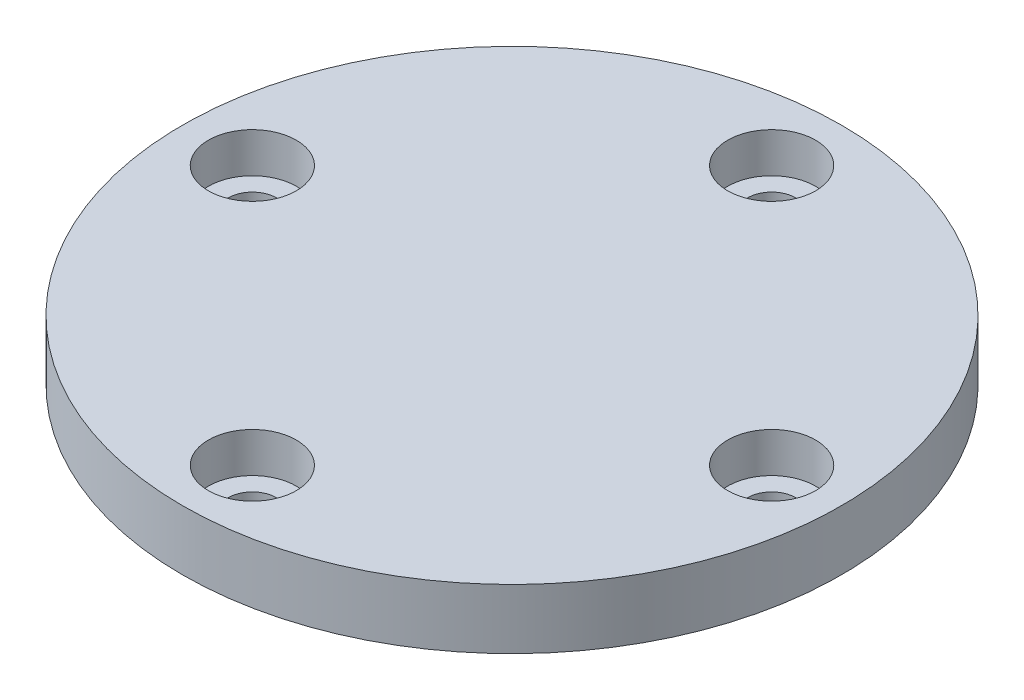
ISO-10303-21;
HEADER;
FILE_DESCRIPTION(('STEP AP214'),'2;1');
FILE_NAME('part.step','',(''),(''),'','','');
FILE_SCHEMA(('AUTOMOTIVE_DESIGN { 1 0 10303 214 1 1 1 1 }'));
ENDSEC;
DATA;
#1=APPLICATION_CONTEXT('core data for automotive mechanical design processes');
#2=APPLICATION_PROTOCOL_DEFINITION('international standard','automotive_design',2000,#1);
#3=PRODUCT_CONTEXT('',#1,'mechanical');
#4=PRODUCT('Part','Part','',(#3));
#5=PRODUCT_RELATED_PRODUCT_CATEGORY('part','',(#4));
#6=PRODUCT_DEFINITION_FORMATION('','',#4);
#7=PRODUCT_DEFINITION_CONTEXT('part definition',#1,'design');
#8=PRODUCT_DEFINITION('design','',#6,#7);
#9=PRODUCT_DEFINITION_SHAPE('','',#8);
#10=(LENGTH_UNIT() NAMED_UNIT(*) SI_UNIT(.MILLI.,.METRE.));
#11=(NAMED_UNIT(*) PLANE_ANGLE_UNIT() SI_UNIT($,.RADIAN.));
#12=(NAMED_UNIT(*) SI_UNIT($,.STERADIAN.) SOLID_ANGLE_UNIT());
#13=UNCERTAINTY_MEASURE_WITH_UNIT(LENGTH_MEASURE(1.E-05),#10,'distance_accuracy_value','');
#14=(GEOMETRIC_REPRESENTATION_CONTEXT(3) GLOBAL_UNCERTAINTY_ASSIGNED_CONTEXT((#13)) GLOBAL_UNIT_ASSIGNED_CONTEXT((#10,
#11,#12)) REPRESENTATION_CONTEXT('',''));
#15=CARTESIAN_POINT('',(0.,0.,0.));
#16=DIRECTION('',(0.,0.,1.));
#17=DIRECTION('',(1.,0.,0.));
#18=AXIS2_PLACEMENT_3D('',#15,#16,#17);
#19=CARTESIAN_POINT('',(0.,3.,0.));
#20=DIRECTION('',(0.,-1.,0.));
#21=DIRECTION('',(0.,0.,-1.));
#22=AXIS2_PLACEMENT_3D('',#19,#20,#21);
#23=CYLINDRICAL_SURFACE('',#22,16.5);
#24=CARTESIAN_POINT('',(0.,3.,0.));
#25=DIRECTION('',(0.,1.,0.));
#26=DIRECTION('',(0.,0.,1.));
#27=AXIS2_PLACEMENT_3D('',#24,#25,#26);
#28=CIRCLE('',#27,16.5);
#29=CARTESIAN_POINT('',(0.,3.,16.5));
#30=VERTEX_POINT('',#29);
#31=EDGE_CURVE('E10',#30,#30,#28,.T.);
#32=ORIENTED_EDGE('',*,*,#31,.F.);
#33=EDGE_LOOP('',(#32));
#34=FACE_BOUND('',#33,.T.);
#35=CARTESIAN_POINT('',(0.,0.,0.));
#36=DIRECTION('',(0.,1.,0.));
#37=DIRECTION('',(0.,0.,1.));
#38=AXIS2_PLACEMENT_3D('',#35,#36,#37);
#39=CIRCLE('',#38,16.5);
#40=CARTESIAN_POINT('',(0.,0.,16.5));
#41=VERTEX_POINT('',#40);
#42=EDGE_CURVE('E41',#41,#41,#39,.T.);
#43=ORIENTED_EDGE('',*,*,#42,.T.);
#44=EDGE_LOOP('',(#43));
#45=FACE_BOUND('',#44,.T.);
#46=ADVANCED_FACE('F38',(#34,#45),#23,.T.);
#47=CARTESIAN_POINT('',(0.,3.,0.));
#48=DIRECTION('',(0.,1.,0.));
#49=DIRECTION('',(0.,0.,1.));
#50=AXIS2_PLACEMENT_3D('',#47,#48,#49);
#51=PLANE('',#50);
#52=CARTESIAN_POINT('',(0.,3.,-13.));
#53=DIRECTION('',(0.,1.,0.));
#54=DIRECTION('',(1.,0.,0.));
#55=AXIS2_PLACEMENT_3D('',#52,#53,#54);
#56=CIRCLE('',#55,2.2);
#57=CARTESIAN_POINT('',(2.19999999999995,3.,-13.));
#58=VERTEX_POINT('',#57);
#59=EDGE_CURVE('E90',#58,#58,#56,.T.);
#60=ORIENTED_EDGE('',*,*,#59,.F.);
#61=EDGE_LOOP('',(#60));
#62=FACE_BOUND('',#61,.T.);
#63=CARTESIAN_POINT('',(-13.,3.,0.));
#64=DIRECTION('',(0.,1.,0.));
#65=DIRECTION('',(0.,0.,-1.));
#66=AXIS2_PLACEMENT_3D('',#63,#64,#65);
#67=CIRCLE('',#66,2.2);
#68=CARTESIAN_POINT('',(-13.,3.,-2.2));
#69=VERTEX_POINT('',#68);
#70=EDGE_CURVE('E72',#69,#69,#67,.T.);
#71=ORIENTED_EDGE('',*,*,#70,.F.);
#72=EDGE_LOOP('',(#71));
#73=FACE_BOUND('',#72,.T.);
#74=CARTESIAN_POINT('',(1.36167772214882E-13,3.,13.));
#75=DIRECTION('',(0.,1.,0.));
#76=DIRECTION('',(-1.,0.,0.));
#77=AXIS2_PLACEMENT_3D('',#74,#75,#76);
#78=CIRCLE('',#77,2.2);
#79=CARTESIAN_POINT('',(-2.19999999999986,3.,13.));
#80=VERTEX_POINT('',#79);
#81=EDGE_CURVE('E81',#80,#80,#78,.T.);
#82=ORIENTED_EDGE('',*,*,#81,.F.);
#83=EDGE_LOOP('',(#82));
#84=FACE_BOUND('',#83,.T.);
#85=CARTESIAN_POINT('',(13.,3.,0.));
#86=DIRECTION('',(0.,1.,0.));
#87=DIRECTION('',(0.,0.,1.));
#88=AXIS2_PLACEMENT_3D('',#85,#86,#87);
#89=CIRCLE('',#88,2.2);
#90=CARTESIAN_POINT('',(13.,3.,2.2));
#91=VERTEX_POINT('',#90);
#92=EDGE_CURVE('E63',#91,#91,#89,.T.);
#93=ORIENTED_EDGE('',*,*,#92,.F.);
#94=EDGE_LOOP('',(#93));
#95=FACE_BOUND('',#94,.T.);
#96=ORIENTED_EDGE('',*,*,#31,.T.);
#97=EDGE_LOOP('',(#96));
#98=FACE_BOUND('',#97,.T.);
#99=ADVANCED_FACE('F137',(#62,#73,#84,#95,#98),#51,.T.);
#100=CARTESIAN_POINT('',(0.,0.,0.));
#101=DIRECTION('',(0.,1.,0.));
#102=DIRECTION('',(0.,0.,1.));
#103=AXIS2_PLACEMENT_3D('',#100,#101,#102);
#104=PLANE('',#103);
#105=CARTESIAN_POINT('',(6.,0.,0.));
#106=DIRECTION('',(0.,-1.,0.));
#107=DIRECTION('',(0.,0.,-1.));
#108=AXIS2_PLACEMENT_3D('',#105,#106,#107);
#109=CIRCLE('',#108,0.500000000000001);
#110=CARTESIAN_POINT('',(6.,0.,-0.500000000000001));
#111=VERTEX_POINT('',#110);
#112=EDGE_CURVE('E116',#111,#111,#109,.T.);
#113=ORIENTED_EDGE('',*,*,#112,.F.);
#114=EDGE_LOOP('',(#113));
#115=FACE_BOUND('',#114,.T.);
#116=CARTESIAN_POINT('',(0.,0.,-13.));
#117=DIRECTION('',(0.,1.,0.));
#118=DIRECTION('',(1.,0.,0.));
#119=AXIS2_PLACEMENT_3D('',#116,#117,#118);
#120=CIRCLE('',#119,1.2);
#121=CARTESIAN_POINT('',(1.19999999999995,0.,-13.));
#122=VERTEX_POINT('',#121);
#123=EDGE_CURVE('E109',#122,#122,#120,.T.);
#124=ORIENTED_EDGE('',*,*,#123,.T.);
#125=EDGE_LOOP('',(#124));
#126=FACE_BOUND('',#125,.T.);
#127=CARTESIAN_POINT('',(-13.,0.,0.));
#128=DIRECTION('',(0.,1.,0.));
#129=DIRECTION('',(0.,0.,-1.));
#130=AXIS2_PLACEMENT_3D('',#127,#128,#129);
#131=CIRCLE('',#130,1.2);
#132=CARTESIAN_POINT('',(-13.,0.,-1.2));
#133=VERTEX_POINT('',#132);
#134=EDGE_CURVE('E95',#133,#133,#131,.T.);
#135=ORIENTED_EDGE('',*,*,#134,.T.);
#136=EDGE_LOOP('',(#135));
#137=FACE_BOUND('',#136,.T.);
#138=CARTESIAN_POINT('',(1.36167772214882E-13,0.,13.));
#139=DIRECTION('',(0.,1.,0.));
#140=DIRECTION('',(-1.,0.,0.));
#141=AXIS2_PLACEMENT_3D('',#138,#139,#140);
#142=CIRCLE('',#141,1.2);
#143=CARTESIAN_POINT('',(-1.19999999999986,0.,13.));
#144=VERTEX_POINT('',#143);
#145=EDGE_CURVE('E77',#144,#144,#142,.T.);
#146=ORIENTED_EDGE('',*,*,#145,.T.);
#147=EDGE_LOOP('',(#146));
#148=FACE_BOUND('',#147,.T.);
#149=CARTESIAN_POINT('',(13.,0.,0.));
#150=DIRECTION('',(0.,1.,0.));
#151=DIRECTION('',(0.,0.,1.));
#152=AXIS2_PLACEMENT_3D('',#149,#150,#151);
#153=CIRCLE('',#152,1.2);
#154=CARTESIAN_POINT('',(13.,0.,1.2));
#155=VERTEX_POINT('',#154);
#156=EDGE_CURVE('E50',#155,#155,#153,.T.);
#157=ORIENTED_EDGE('',*,*,#156,.T.);
#158=EDGE_LOOP('',(#157));
#159=FACE_BOUND('',#158,.T.);
#160=ORIENTED_EDGE('',*,*,#42,.F.);
#161=EDGE_LOOP('',(#160));
#162=FACE_BOUND('',#161,.T.);
#163=ADVANCED_FACE('F133',(#115,#126,#137,#148,#159,#162),#104,.F.);
#164=CARTESIAN_POINT('',(13.,3.,0.));
#165=DIRECTION('',(0.,1.,0.));
#166=DIRECTION('',(0.,0.,1.));
#167=AXIS2_PLACEMENT_3D('',#164,#165,#166);
#168=CYLINDRICAL_SURFACE('',#167,1.2);
#169=ORIENTED_EDGE('',*,*,#156,.F.);
#170=EDGE_LOOP('',(#169));
#171=FACE_BOUND('',#170,.T.);
#172=CARTESIAN_POINT('',(13.,1.,0.));
#173=DIRECTION('',(0.,1.,0.));
#174=DIRECTION('',(0.,0.,1.));
#175=AXIS2_PLACEMENT_3D('',#172,#173,#174);
#176=CIRCLE('',#175,1.2);
#177=CARTESIAN_POINT('',(13.,1.,1.2));
#178=VERTEX_POINT('',#177);
#179=EDGE_CURVE('E55',#178,#178,#176,.T.);
#180=ORIENTED_EDGE('',*,*,#179,.T.);
#181=EDGE_LOOP('',(#180));
#182=FACE_BOUND('',#181,.T.);
#183=ADVANCED_FACE('F136',(#171,#182),#168,.F.);
#184=CARTESIAN_POINT('',(14.2,1.,0.));
#185=DIRECTION('',(0.,-1.,0.));
#186=DIRECTION('',(0.,0.,-1.));
#187=AXIS2_PLACEMENT_3D('',#184,#185,#186);
#188=PLANE('',#187);
#189=ORIENTED_EDGE('',*,*,#179,.F.);
#190=EDGE_LOOP('',(#189));
#191=FACE_BOUND('',#190,.T.);
#192=CARTESIAN_POINT('',(13.,1.,0.));
#193=DIRECTION('',(0.,1.,0.));
#194=DIRECTION('',(0.,0.,1.));
#195=AXIS2_PLACEMENT_3D('',#192,#193,#194);
#196=CIRCLE('',#195,2.2);
#197=CARTESIAN_POINT('',(13.,1.,2.2));
#198=VERTEX_POINT('',#197);
#199=EDGE_CURVE('E59',#198,#198,#196,.T.);
#200=ORIENTED_EDGE('',*,*,#199,.T.);
#201=EDGE_LOOP('',(#200));
#202=FACE_BOUND('',#201,.T.);
#203=ADVANCED_FACE('F162',(#191,#202),#188,.F.);
#204=CARTESIAN_POINT('',(13.,3.,0.));
#205=DIRECTION('',(0.,1.,0.));
#206=DIRECTION('',(0.,0.,1.));
#207=AXIS2_PLACEMENT_3D('',#204,#205,#206);
#208=CYLINDRICAL_SURFACE('',#207,2.2);
#209=ORIENTED_EDGE('',*,*,#199,.F.);
#210=EDGE_LOOP('',(#209));
#211=FACE_BOUND('',#210,.T.);
#212=ORIENTED_EDGE('',*,*,#92,.T.);
#213=EDGE_LOOP('',(#212));
#214=FACE_BOUND('',#213,.T.);
#215=ADVANCED_FACE('F166',(#211,#214),#208,.F.);
#216=CARTESIAN_POINT('',(1.36167772214882E-13,3.,13.));
#217=DIRECTION('',(0.,1.,0.));
#218=DIRECTION('',(-1.,0.,0.));
#219=AXIS2_PLACEMENT_3D('',#216,#217,#218);
#220=CYLINDRICAL_SURFACE('',#219,1.2);
#221=ORIENTED_EDGE('',*,*,#145,.F.);
#222=EDGE_LOOP('',(#221));
#223=FACE_BOUND('',#222,.T.);
#224=CARTESIAN_POINT('',(1.36167772214882E-13,1.,13.));
#225=DIRECTION('',(0.,1.,0.));
#226=DIRECTION('',(-1.,0.,0.));
#227=AXIS2_PLACEMENT_3D('',#224,#225,#226);
#228=CIRCLE('',#227,1.2);
#229=CARTESIAN_POINT('',(-1.19999999999986,1.,13.));
#230=VERTEX_POINT('',#229);
#231=EDGE_CURVE('E68',#230,#230,#228,.T.);
#232=ORIENTED_EDGE('',*,*,#231,.T.);
#233=EDGE_LOOP('',(#232));
#234=FACE_BOUND('',#233,.T.);
#235=ADVANCED_FACE('F170',(#223,#234),#220,.F.);
#236=CARTESIAN_POINT('',(1.48737105034717E-13,1.,14.2));
#237=DIRECTION('',(0.,-1.,0.));
#238=DIRECTION('',(1.,0.,0.));
#239=AXIS2_PLACEMENT_3D('',#236,#237,#238);
#240=PLANE('',#239);
#241=ORIENTED_EDGE('',*,*,#231,.F.);
#242=EDGE_LOOP('',(#241));
#243=FACE_BOUND('',#242,.T.);
#244=CARTESIAN_POINT('',(1.36167772214882E-13,1.,13.));
#245=DIRECTION('',(0.,1.,0.));
#246=DIRECTION('',(-1.,0.,0.));
#247=AXIS2_PLACEMENT_3D('',#244,#245,#246);
#248=CIRCLE('',#247,2.2);
#249=CARTESIAN_POINT('',(-2.19999999999986,1.,13.));
#250=VERTEX_POINT('',#249);
#251=EDGE_CURVE('E73',#250,#250,#248,.T.);
#252=ORIENTED_EDGE('',*,*,#251,.T.);
#253=EDGE_LOOP('',(#252));
#254=FACE_BOUND('',#253,.T.);
#255=ADVANCED_FACE('F174',(#243,#254),#240,.F.);
#256=CARTESIAN_POINT('',(1.36167772214882E-13,3.,13.));
#257=DIRECTION('',(0.,1.,0.));
#258=DIRECTION('',(-1.,0.,0.));
#259=AXIS2_PLACEMENT_3D('',#256,#257,#258);
#260=CYLINDRICAL_SURFACE('',#259,2.2);
#261=ORIENTED_EDGE('',*,*,#251,.F.);
#262=EDGE_LOOP('',(#261));
#263=FACE_BOUND('',#262,.T.);
#264=ORIENTED_EDGE('',*,*,#81,.T.);
#265=EDGE_LOOP('',(#264));
#266=FACE_BOUND('',#265,.T.);
#267=ADVANCED_FACE('F178',(#263,#266),#260,.F.);
#268=CARTESIAN_POINT('',(-13.,3.,0.));
#269=DIRECTION('',(0.,1.,0.));
#270=DIRECTION('',(0.,0.,-1.));
#271=AXIS2_PLACEMENT_3D('',#268,#269,#270);
#272=CYLINDRICAL_SURFACE('',#271,1.2);
#273=ORIENTED_EDGE('',*,*,#134,.F.);
#274=EDGE_LOOP('',(#273));
#275=FACE_BOUND('',#274,.T.);
#276=CARTESIAN_POINT('',(-13.,1.,0.));
#277=DIRECTION('',(0.,1.,0.));
#278=DIRECTION('',(0.,0.,-1.));
#279=AXIS2_PLACEMENT_3D('',#276,#277,#278);
#280=CIRCLE('',#279,1.2);
#281=CARTESIAN_POINT('',(-13.,1.,-1.2));
#282=VERTEX_POINT('',#281);
#283=EDGE_CURVE('E86',#282,#282,#280,.T.);
#284=ORIENTED_EDGE('',*,*,#283,.T.);
#285=EDGE_LOOP('',(#284));
#286=FACE_BOUND('',#285,.T.);
#287=ADVANCED_FACE('F182',(#275,#286),#272,.F.);
#288=CARTESIAN_POINT('',(-14.2,1.,0.));
#289=DIRECTION('',(0.,-1.,0.));
#290=DIRECTION('',(0.,0.,1.));
#291=AXIS2_PLACEMENT_3D('',#288,#289,#290);
#292=PLANE('',#291);
#293=ORIENTED_EDGE('',*,*,#283,.F.);
#294=EDGE_LOOP('',(#293));
#295=FACE_BOUND('',#294,.T.);
#296=CARTESIAN_POINT('',(-13.,1.,0.));
#297=DIRECTION('',(0.,1.,0.));
#298=DIRECTION('',(0.,0.,-1.));
#299=AXIS2_PLACEMENT_3D('',#296,#297,#298);
#300=CIRCLE('',#299,2.2);
#301=CARTESIAN_POINT('',(-13.,1.,-2.2));
#302=VERTEX_POINT('',#301);
#303=EDGE_CURVE('E91',#302,#302,#300,.T.);
#304=ORIENTED_EDGE('',*,*,#303,.T.);
#305=EDGE_LOOP('',(#304));
#306=FACE_BOUND('',#305,.T.);
#307=ADVANCED_FACE('F186',(#295,#306),#292,.F.);
#308=CARTESIAN_POINT('',(-13.,3.,0.));
#309=DIRECTION('',(0.,1.,0.));
#310=DIRECTION('',(0.,0.,-1.));
#311=AXIS2_PLACEMENT_3D('',#308,#309,#310);
#312=CYLINDRICAL_SURFACE('',#311,2.2);
#313=ORIENTED_EDGE('',*,*,#303,.F.);
#314=EDGE_LOOP('',(#313));
#315=FACE_BOUND('',#314,.T.);
#316=ORIENTED_EDGE('',*,*,#70,.T.);
#317=EDGE_LOOP('',(#316));
#318=FACE_BOUND('',#317,.T.);
#319=ADVANCED_FACE('F190',(#315,#318),#312,.F.);
#320=CARTESIAN_POINT('',(0.,3.,-13.));
#321=DIRECTION('',(0.,1.,0.));
#322=DIRECTION('',(1.,0.,0.));
#323=AXIS2_PLACEMENT_3D('',#320,#321,#322);
#324=CYLINDRICAL_SURFACE('',#323,1.2);
#325=ORIENTED_EDGE('',*,*,#123,.F.);
#326=EDGE_LOOP('',(#325));
#327=FACE_BOUND('',#326,.T.);
#328=CARTESIAN_POINT('',(0.,1.,-13.));
#329=DIRECTION('',(0.,1.,0.));
#330=DIRECTION('',(1.,0.,0.));
#331=AXIS2_PLACEMENT_3D('',#328,#329,#330);
#332=CIRCLE('',#331,1.2);
#333=CARTESIAN_POINT('',(1.19999999999995,1.,-13.));
#334=VERTEX_POINT('',#333);
#335=EDGE_CURVE('E67',#334,#334,#332,.T.);
#336=ORIENTED_EDGE('',*,*,#335,.T.);
#337=EDGE_LOOP('',(#336));
#338=FACE_BOUND('',#337,.T.);
#339=ADVANCED_FACE('F194',(#327,#338),#324,.F.);
#340=CARTESIAN_POINT('',(0.,1.,-14.2));
#341=DIRECTION('',(0.,-1.,0.));
#342=DIRECTION('',(-1.,0.,0.));
#343=AXIS2_PLACEMENT_3D('',#340,#341,#342);
#344=PLANE('',#343);
#345=ORIENTED_EDGE('',*,*,#335,.F.);
#346=EDGE_LOOP('',(#345));
#347=FACE_BOUND('',#346,.T.);
#348=CARTESIAN_POINT('',(0.,1.,-13.));
#349=DIRECTION('',(0.,1.,0.));
#350=DIRECTION('',(1.,0.,0.));
#351=AXIS2_PLACEMENT_3D('',#348,#349,#350);
#352=CIRCLE('',#351,2.2);
#353=CARTESIAN_POINT('',(2.19999999999995,1.,-13.));
#354=VERTEX_POINT('',#353);
#355=EDGE_CURVE('E105',#354,#354,#352,.T.);
#356=ORIENTED_EDGE('',*,*,#355,.T.);
#357=EDGE_LOOP('',(#356));
#358=FACE_BOUND('',#357,.T.);
#359=ADVANCED_FACE('F198',(#347,#358),#344,.F.);
#360=CARTESIAN_POINT('',(0.,3.,-13.));
#361=DIRECTION('',(0.,1.,0.));
#362=DIRECTION('',(1.,0.,0.));
#363=AXIS2_PLACEMENT_3D('',#360,#361,#362);
#364=CYLINDRICAL_SURFACE('',#363,2.2);
#365=ORIENTED_EDGE('',*,*,#355,.F.);
#366=EDGE_LOOP('',(#365));
#367=FACE_BOUND('',#366,.T.);
#368=ORIENTED_EDGE('',*,*,#59,.T.);
#369=EDGE_LOOP('',(#368));
#370=FACE_BOUND('',#369,.T.);
#371=ADVANCED_FACE('F129',(#367,#370),#364,.F.);
#372=CARTESIAN_POINT('',(6.,1.5,0.));
#373=DIRECTION('',(0.,-1.,0.));
#374=DIRECTION('',(0.,0.,-1.));
#375=AXIS2_PLACEMENT_3D('',#372,#373,#374);
#376=CYLINDRICAL_SURFACE('',#375,0.500000000000001);
#377=CARTESIAN_POINT('',(6.,1.5,0.));
#378=DIRECTION('',(0.,-1.,0.));
#379=DIRECTION('',(0.,0.,-1.));
#380=AXIS2_PLACEMENT_3D('',#377,#378,#379);
#381=CIRCLE('',#380,0.500000000000001);
#382=CARTESIAN_POINT('',(6.,1.5,-0.500000000000001));
#383=VERTEX_POINT('',#382);
#384=EDGE_CURVE('E85',#383,#383,#381,.T.);
#385=ORIENTED_EDGE('',*,*,#384,.F.);
#386=EDGE_LOOP('',(#385));
#387=FACE_BOUND('',#386,.T.);
#388=ORIENTED_EDGE('',*,*,#112,.T.);
#389=EDGE_LOOP('',(#388));
#390=FACE_BOUND('',#389,.T.);
#391=ADVANCED_FACE('F126',(#387,#390),#376,.F.);
#392=CARTESIAN_POINT('',(6.,1.5,0.));
#393=DIRECTION('',(0.,-1.,0.));
#394=DIRECTION('',(0.,0.,-1.));
#395=AXIS2_PLACEMENT_3D('',#392,#393,#394);
#396=PLANE('',#395);
#397=ORIENTED_EDGE('',*,*,#384,.T.);
#398=EDGE_LOOP('',(#397));
#399=FACE_BOUND('',#398,.T.);
#400=ADVANCED_FACE('F124',(#399),#396,.T.);
#401=CLOSED_SHELL('',(#46,#99,#163,#183,#203,#215,#235,#255,#267,#287,#307,#319,#339,#359,#371,
#391,#400));
#402=MANIFOLD_SOLID_BREP('B2',#401);
#403=ADVANCED_BREP_SHAPE_REPRESENTATION('',(#18,#402),#14);
#404=SHAPE_DEFINITION_REPRESENTATION(#9,#403);
ENDSEC;
END-ISO-10303-21;
